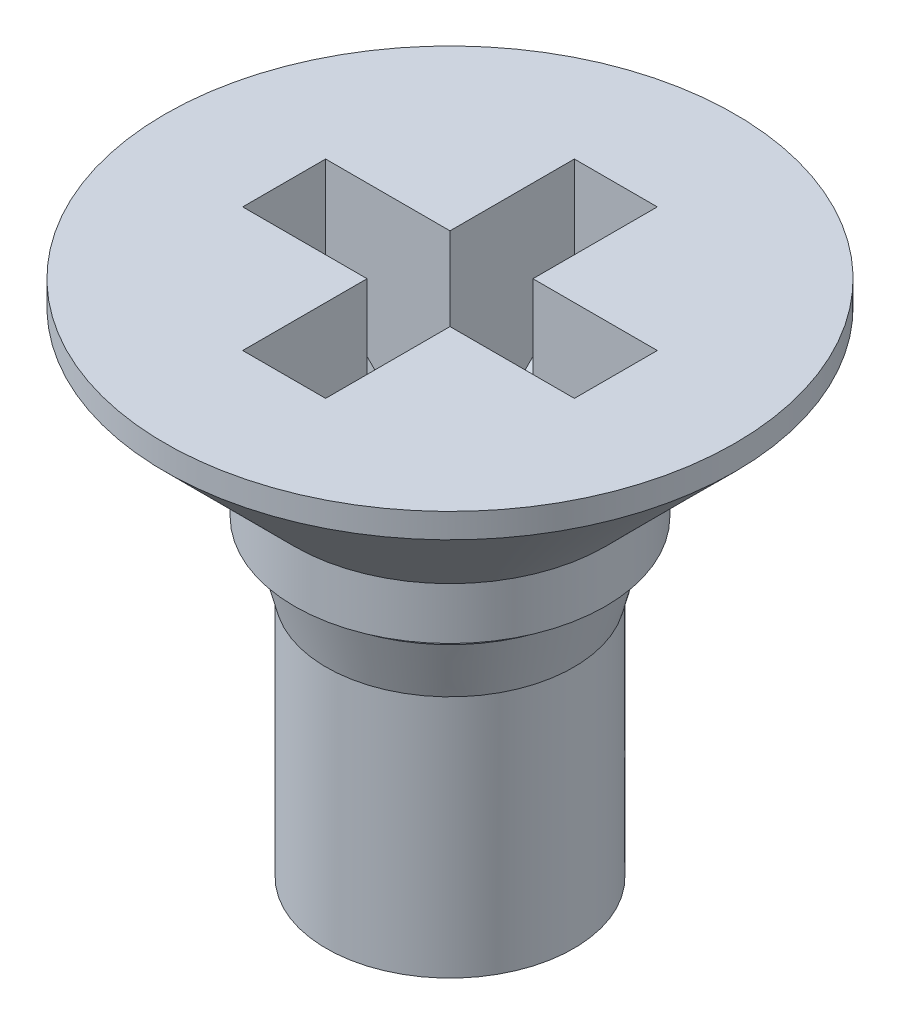
ISO-10303-21;
HEADER;
FILE_DESCRIPTION(('STEP AP214'),'2;1');
FILE_NAME('part.step','',(''),(''),'','','');
FILE_SCHEMA(('AUTOMOTIVE_DESIGN { 1 0 10303 214 1 1 1 1 }'));
ENDSEC;
DATA;
#1=APPLICATION_CONTEXT('core data for automotive mechanical design processes');
#2=APPLICATION_PROTOCOL_DEFINITION('international standard','automotive_design',2000,#1);
#3=PRODUCT_CONTEXT('',#1,'mechanical');
#4=PRODUCT('Part','Part','',(#3));
#5=PRODUCT_RELATED_PRODUCT_CATEGORY('part','',(#4));
#6=PRODUCT_DEFINITION_FORMATION('','',#4);
#7=PRODUCT_DEFINITION_CONTEXT('part definition',#1,'design');
#8=PRODUCT_DEFINITION('design','',#6,#7);
#9=PRODUCT_DEFINITION_SHAPE('','',#8);
#10=(LENGTH_UNIT() NAMED_UNIT(*) SI_UNIT(.MILLI.,.METRE.));
#11=(NAMED_UNIT(*) PLANE_ANGLE_UNIT() SI_UNIT($,.RADIAN.));
#12=(NAMED_UNIT(*) SI_UNIT($,.STERADIAN.) SOLID_ANGLE_UNIT());
#13=UNCERTAINTY_MEASURE_WITH_UNIT(LENGTH_MEASURE(1.E-05),#10,'distance_accuracy_value','');
#14=(GEOMETRIC_REPRESENTATION_CONTEXT(3) GLOBAL_UNCERTAINTY_ASSIGNED_CONTEXT((#13)) GLOBAL_UNIT_ASSIGNED_CONTEXT((#10,
#11,#12)) REPRESENTATION_CONTEXT('',''));
#15=CARTESIAN_POINT('',(0.,0.,0.));
#16=DIRECTION('',(0.,0.,1.));
#17=DIRECTION('',(1.,0.,0.));
#18=AXIS2_PLACEMENT_3D('',#15,#16,#17);
#19=CARTESIAN_POINT('',(0.,0.,0.));
#20=DIRECTION('',(0.,1.,0.));
#21=DIRECTION('',(-1.,0.,0.));
#22=AXIS2_PLACEMENT_3D('',#19,#20,#21);
#23=CYLINDRICAL_SURFACE('',#22,1.1935);
#24=CARTESIAN_POINT('',(0.,-2.65,0.));
#25=DIRECTION('',(0.,1.,0.));
#26=DIRECTION('',(-1.,0.,0.));
#27=AXIS2_PLACEMENT_3D('',#24,#25,#26);
#28=CIRCLE('',#27,1.1935);
#29=CARTESIAN_POINT('',(-1.1935,-2.65,0.));
#30=VERTEX_POINT('',#29);
#31=EDGE_CURVE('E257',#30,#30,#28,.T.);
#32=ORIENTED_EDGE('',*,*,#31,.F.);
#33=EDGE_LOOP('',(#32));
#34=FACE_BOUND('',#33,.T.);
#35=CARTESIAN_POINT('',(0.,-5.,0.));
#36=DIRECTION('',(0.,-1.,0.));
#37=DIRECTION('',(0.,0.,-1.));
#38=AXIS2_PLACEMENT_3D('',#35,#36,#37);
#39=CIRCLE('',#38,1.1935);
#40=CARTESIAN_POINT('',(0.,-5.,-1.1935));
#41=VERTEX_POINT('',#40);
#42=EDGE_CURVE('E11',#41,#41,#39,.T.);
#43=ORIENTED_EDGE('',*,*,#42,.F.);
#44=EDGE_LOOP('',(#43));
#45=FACE_BOUND('',#44,.T.);
#46=ADVANCED_FACE('F38',(#34,#45),#23,.T.);
#47=CARTESIAN_POINT('',(0.,-2.65,-0.4));
#48=DIRECTION('',(0.,0.,-1.));
#49=DIRECTION('',(-1.,0.,0.));
#50=AXIS2_PLACEMENT_3D('',#47,#48,#49);
#51=PLANE('',#50);
#52=DIRECTION('',(0.,1.,0.));
#53=VECTOR('',#52,1.);
#54=CARTESIAN_POINT('',(0.4,-2.65,-0.4));
#55=LINE('',#54,#53);
#56=CARTESIAN_POINT('',(0.4,-2.1,-0.4));
#57=VERTEX_POINT('',#56);
#58=CARTESIAN_POINT('',(0.4,0.,-0.4));
#59=VERTEX_POINT('',#58);
#60=EDGE_CURVE('E202',#57,#59,#55,.T.);
#61=ORIENTED_EDGE('',*,*,#60,.F.);
#62=DIRECTION('',(1.,0.,0.));
#63=VECTOR('',#62,1.);
#64=CARTESIAN_POINT('',(-0.550000000000002,-2.1,-0.4));
#65=LINE('',#64,#63);
#66=CARTESIAN_POINT('',(0.550000000000002,-2.1,-0.4));
#67=VERTEX_POINT('',#66);
#68=EDGE_CURVE('E237',#57,#67,#65,.T.);
#69=ORIENTED_EDGE('',*,*,#68,.T.);
#70=DIRECTION('',(0.707106781186546,0.707106781186548,0.));
#71=VECTOR('',#70,1.);
#72=CARTESIAN_POINT('',(1.6,-1.05,-0.4));
#73=LINE('',#72,#71);
#74=CARTESIAN_POINT('',(1.6,-1.05,-0.4));
#75=VERTEX_POINT('',#74);
#76=EDGE_CURVE('E241',#67,#75,#73,.T.);
#77=ORIENTED_EDGE('',*,*,#76,.T.);
#78=DIRECTION('',(0.,1.,0.));
#79=VECTOR('',#78,1.);
#80=CARTESIAN_POINT('',(1.6,0.,-0.4));
#81=LINE('',#80,#79);
#82=CARTESIAN_POINT('',(1.6,0.,-0.4));
#83=VERTEX_POINT('',#82);
#84=EDGE_CURVE('E244',#75,#83,#81,.T.);
#85=ORIENTED_EDGE('',*,*,#84,.T.);
#86=DIRECTION('',(-1.,0.,0.));
#87=VECTOR('',#86,1.);
#88=CARTESIAN_POINT('',(1.6,0.,-0.4));
#89=LINE('',#88,#87);
#90=EDGE_CURVE('E248',#83,#59,#89,.T.);
#91=ORIENTED_EDGE('',*,*,#90,.T.);
#92=EDGE_LOOP('',(#61,#69,#77,#85,#91));
#93=FACE_BOUND('',#92,.T.);
#94=ADVANCED_FACE('F328',(#93),#51,.F.);
#95=CARTESIAN_POINT('',(0.,-2.65,0.4));
#96=DIRECTION('',(0.,0.,-1.));
#97=DIRECTION('',(-1.,0.,0.));
#98=AXIS2_PLACEMENT_3D('',#95,#96,#97);
#99=PLANE('',#98);
#100=DIRECTION('',(1.,0.,0.));
#101=VECTOR('',#100,1.);
#102=CARTESIAN_POINT('',(-0.550000000000002,-2.1,0.4));
#103=LINE('',#102,#101);
#104=CARTESIAN_POINT('',(0.4,-2.1,0.4));
#105=VERTEX_POINT('',#104);
#106=CARTESIAN_POINT('',(0.550000000000002,-2.1,0.4));
#107=VERTEX_POINT('',#106);
#108=EDGE_CURVE('E219',#105,#107,#103,.T.);
#109=ORIENTED_EDGE('',*,*,#108,.F.);
#110=DIRECTION('',(0.,1.,0.));
#111=VECTOR('',#110,1.);
#112=CARTESIAN_POINT('',(0.4,-2.65,0.4));
#113=LINE('',#112,#111);
#114=CARTESIAN_POINT('',(0.4,0.,0.4));
#115=VERTEX_POINT('',#114);
#116=EDGE_CURVE('E169',#105,#115,#113,.T.);
#117=ORIENTED_EDGE('',*,*,#116,.T.);
#118=DIRECTION('',(-1.,0.,0.));
#119=VECTOR('',#118,1.);
#120=CARTESIAN_POINT('',(1.6,0.,0.4));
#121=LINE('',#120,#119);
#122=CARTESIAN_POINT('',(1.6,0.,0.4));
#123=VERTEX_POINT('',#122);
#124=EDGE_CURVE('E228',#123,#115,#121,.T.);
#125=ORIENTED_EDGE('',*,*,#124,.F.);
#126=DIRECTION('',(0.,1.,0.));
#127=VECTOR('',#126,1.);
#128=CARTESIAN_POINT('',(1.6,0.,0.4));
#129=LINE('',#128,#127);
#130=CARTESIAN_POINT('',(1.6,-1.05,0.4));
#131=VERTEX_POINT('',#130);
#132=EDGE_CURVE('E225',#131,#123,#129,.T.);
#133=ORIENTED_EDGE('',*,*,#132,.F.);
#134=DIRECTION('',(0.707106781186546,0.707106781186548,0.));
#135=VECTOR('',#134,1.);
#136=CARTESIAN_POINT('',(1.6,-1.05,0.4));
#137=LINE('',#136,#135);
#138=EDGE_CURVE('E222',#107,#131,#137,.T.);
#139=ORIENTED_EDGE('',*,*,#138,.F.);
#140=EDGE_LOOP('',(#109,#117,#125,#133,#139));
#141=FACE_BOUND('',#140,.T.);
#142=ADVANCED_FACE('F336',(#141),#99,.T.);
#143=CARTESIAN_POINT('',(0.,0.,0.));
#144=DIRECTION('',(0.,-1.,0.));
#145=DIRECTION('',(1.,0.,0.));
#146=AXIS2_PLACEMENT_3D('',#143,#144,#145);
#147=PLANE('',#146);
#148=DIRECTION('',(1.,0.,0.));
#149=VECTOR('',#148,1.);
#150=CARTESIAN_POINT('',(-0.4,0.,1.6));
#151=LINE('',#150,#149);
#152=CARTESIAN_POINT('',(-0.4,0.,1.6));
#153=VERTEX_POINT('',#152);
#154=CARTESIAN_POINT('',(0.4,0.,1.6));
#155=VERTEX_POINT('',#154);
#156=EDGE_CURVE('E203',#153,#155,#151,.T.);
#157=ORIENTED_EDGE('',*,*,#156,.F.);
#158=DIRECTION('',(0.,0.,1.));
#159=VECTOR('',#158,1.);
#160=CARTESIAN_POINT('',(-0.4,0.,-1.6));
#161=LINE('',#160,#159);
#162=CARTESIAN_POINT('',(-0.4,0.,0.399999999999999));
#163=VERTEX_POINT('',#162);
#164=EDGE_CURVE('E196',#163,#153,#161,.T.);
#165=ORIENTED_EDGE('',*,*,#164,.F.);
#166=CARTESIAN_POINT('',(-1.6,0.,0.4));
#167=VERTEX_POINT('',#166);
#168=EDGE_CURVE('E227',#163,#167,#121,.T.);
#169=ORIENTED_EDGE('',*,*,#168,.T.);
#170=DIRECTION('',(0.,0.,1.));
#171=VECTOR('',#170,1.);
#172=CARTESIAN_POINT('',(-1.6,0.,-0.4));
#173=LINE('',#172,#171);
#174=CARTESIAN_POINT('',(-1.6,0.,-0.4));
#175=VERTEX_POINT('',#174);
#176=EDGE_CURVE('E258',#175,#167,#173,.T.);
#177=ORIENTED_EDGE('',*,*,#176,.F.);
#178=CARTESIAN_POINT('',(-0.4,0.,-0.4));
#179=VERTEX_POINT('',#178);
#180=EDGE_CURVE('E247',#179,#175,#89,.T.);
#181=ORIENTED_EDGE('',*,*,#180,.F.);
#182=CARTESIAN_POINT('',(-0.4,0.,-1.6));
#183=VERTEX_POINT('',#182);
#184=EDGE_CURVE('E197',#183,#179,#161,.T.);
#185=ORIENTED_EDGE('',*,*,#184,.F.);
#186=DIRECTION('',(1.,0.,0.));
#187=VECTOR('',#186,1.);
#188=CARTESIAN_POINT('',(-0.4,0.,-1.6));
#189=LINE('',#188,#187);
#190=CARTESIAN_POINT('',(0.4,0.,-1.6));
#191=VERTEX_POINT('',#190);
#192=EDGE_CURVE('E205',#183,#191,#189,.T.);
#193=ORIENTED_EDGE('',*,*,#192,.T.);
#194=DIRECTION('',(0.,0.,1.));
#195=VECTOR('',#194,1.);
#196=CARTESIAN_POINT('',(0.4,0.,-1.6));
#197=LINE('',#196,#195);
#198=EDGE_CURVE('E181',#191,#59,#197,.T.);
#199=ORIENTED_EDGE('',*,*,#198,.T.);
#200=ORIENTED_EDGE('',*,*,#90,.F.);
#201=DIRECTION('',(0.,0.,1.));
#202=VECTOR('',#201,1.);
#203=CARTESIAN_POINT('',(1.6,0.,-0.4));
#204=LINE('',#203,#202);
#205=EDGE_CURVE('E261',#83,#123,#204,.T.);
#206=ORIENTED_EDGE('',*,*,#205,.T.);
#207=ORIENTED_EDGE('',*,*,#124,.T.);
#208=EDGE_CURVE('E61',#115,#155,#197,.T.);
#209=ORIENTED_EDGE('',*,*,#208,.T.);
#210=EDGE_LOOP('',(#157,#165,#169,#177,#181,#185,#193,#199,#200,#206,#207,#209));
#211=FACE_BOUND('',#210,.T.);
#212=CARTESIAN_POINT('',(0.,0.,0.));
#213=DIRECTION('',(0.,1.,0.));
#214=DIRECTION('',(-1.,0.,0.));
#215=AXIS2_PLACEMENT_3D('',#212,#213,#214);
#216=CIRCLE('',#215,2.75);
#217=CARTESIAN_POINT('',(-2.75,0.,0.));
#218=VERTEX_POINT('',#217);
#219=EDGE_CURVE('E287',#218,#218,#216,.T.);
#220=ORIENTED_EDGE('',*,*,#219,.T.);
#221=EDGE_LOOP('',(#220));
#222=FACE_BOUND('',#221,.T.);
#223=ADVANCED_FACE('F40',(#211,#222),#147,.F.);
#224=CARTESIAN_POINT('',(0.,0.,0.));
#225=DIRECTION('',(0.,1.,0.));
#226=DIRECTION('',(-1.,0.,0.));
#227=AXIS2_PLACEMENT_3D('',#224,#225,#226);
#228=CYLINDRICAL_SURFACE('',#227,2.75);
#229=ORIENTED_EDGE('',*,*,#219,.F.);
#230=EDGE_LOOP('',(#229));
#231=FACE_BOUND('',#230,.T.);
#232=CARTESIAN_POINT('',(0.,-0.237500000000007,0.));
#233=DIRECTION('',(0.,1.,0.));
#234=DIRECTION('',(-1.,0.,0.));
#235=AXIS2_PLACEMENT_3D('',#232,#233,#234);
#236=CIRCLE('',#235,2.75);
#237=CARTESIAN_POINT('',(-2.75,-0.237500000000007,0.));
#238=VERTEX_POINT('',#237);
#239=EDGE_CURVE('E284',#238,#238,#236,.T.);
#240=ORIENTED_EDGE('',*,*,#239,.T.);
#241=EDGE_LOOP('',(#240));
#242=FACE_BOUND('',#241,.T.);
#243=ADVANCED_FACE('F379',(#231,#242),#228,.T.);
#244=CARTESIAN_POINT('',(0.,-1.4875,0.));
#245=DIRECTION('',(0.,1.,0.));
#246=DIRECTION('',(-1.,0.,0.));
#247=AXIS2_PLACEMENT_3D('',#244,#245,#246);
#248=CONICAL_SURFACE('',#247,1.5,0.78539816339745);
#249=ORIENTED_EDGE('',*,*,#239,.F.);
#250=EDGE_LOOP('',(#249));
#251=FACE_BOUND('',#250,.T.);
#252=CARTESIAN_POINT('',(0.,-1.4875,0.));
#253=DIRECTION('',(0.,1.,0.));
#254=DIRECTION('',(-1.,0.,0.));
#255=AXIS2_PLACEMENT_3D('',#252,#253,#254);
#256=CIRCLE('',#255,1.5);
#257=CARTESIAN_POINT('',(-1.5,-1.4875,0.));
#258=VERTEX_POINT('',#257);
#259=EDGE_CURVE('E281',#258,#258,#256,.T.);
#260=ORIENTED_EDGE('',*,*,#259,.T.);
#261=EDGE_LOOP('',(#260));
#262=FACE_BOUND('',#261,.T.);
#263=ADVANCED_FACE('F376',(#251,#262),#248,.T.);
#264=CARTESIAN_POINT('',(0.,0.,0.));
#265=DIRECTION('',(0.,1.,0.));
#266=DIRECTION('',(-1.,0.,0.));
#267=AXIS2_PLACEMENT_3D('',#264,#265,#266);
#268=CYLINDRICAL_SURFACE('',#267,1.5);
#269=ORIENTED_EDGE('',*,*,#259,.F.);
#270=EDGE_LOOP('',(#269));
#271=FACE_BOUND('',#270,.T.);
#272=CARTESIAN_POINT('',(0.,-1.9875,0.));
#273=DIRECTION('',(0.,1.,0.));
#274=DIRECTION('',(-1.,0.,0.));
#275=AXIS2_PLACEMENT_3D('',#272,#273,#274);
#276=CIRCLE('',#275,1.5);
#277=CARTESIAN_POINT('',(-1.5,-1.9875,0.));
#278=VERTEX_POINT('',#277);
#279=EDGE_CURVE('E278',#278,#278,#276,.T.);
#280=ORIENTED_EDGE('',*,*,#279,.T.);
#281=EDGE_LOOP('',(#280));
#282=FACE_BOUND('',#281,.T.);
#283=ADVANCED_FACE('F372',(#271,#282),#268,.T.);
#284=CARTESIAN_POINT('',(1.5,-1.9875,0.));
#285=DIRECTION('',(0.,1.,0.));
#286=DIRECTION('',(-1.,0.,0.));
#287=AXIS2_PLACEMENT_3D('',#284,#285,#286);
#288=PLANE('',#287);
#289=ORIENTED_EDGE('',*,*,#279,.F.);
#290=EDGE_LOOP('',(#289));
#291=FACE_BOUND('',#290,.T.);
#292=CARTESIAN_POINT('',(0.,-1.9875,0.));
#293=DIRECTION('',(0.,1.,0.));
#294=DIRECTION('',(-1.,0.,0.));
#295=AXIS2_PLACEMENT_3D('',#292,#293,#294);
#296=CIRCLE('',#295,1.3375);
#297=CARTESIAN_POINT('',(-1.3375,-1.9875,0.));
#298=VERTEX_POINT('',#297);
#299=EDGE_CURVE('E275',#298,#298,#296,.T.);
#300=ORIENTED_EDGE('',*,*,#299,.T.);
#301=EDGE_LOOP('',(#300));
#302=FACE_BOUND('',#301,.T.);
#303=ADVANCED_FACE('F368',(#291,#302),#288,.F.);
#304=CARTESIAN_POINT('',(0.,0.,0.));
#305=DIRECTION('',(0.,1.,0.));
#306=DIRECTION('',(-1.,0.,0.));
#307=AXIS2_PLACEMENT_3D('',#304,#305,#306);
#308=CYLINDRICAL_SURFACE('',#307,1.3375);
#309=ORIENTED_EDGE('',*,*,#299,.F.);
#310=EDGE_LOOP('',(#309));
#311=FACE_BOUND('',#310,.T.);
#312=CARTESIAN_POINT('',(0.,-2.11258468371008,0.));
#313=DIRECTION('',(0.,1.,0.));
#314=DIRECTION('',(-1.,0.,0.));
#315=AXIS2_PLACEMENT_3D('',#312,#313,#314);
#316=CIRCLE('',#315,1.3375);
#317=CARTESIAN_POINT('',(-1.3375,-2.11258468371008,0.));
#318=VERTEX_POINT('',#317);
#319=EDGE_CURVE('E272',#318,#318,#316,.T.);
#320=ORIENTED_EDGE('',*,*,#319,.T.);
#321=EDGE_LOOP('',(#320));
#322=FACE_BOUND('',#321,.T.);
#323=ADVANCED_FACE('F364',(#311,#322),#308,.T.);
#324=CARTESIAN_POINT('',(0.,-2.65,0.));
#325=DIRECTION('',(0.,1.,0.));
#326=DIRECTION('',(-1.,0.,0.));
#327=AXIS2_PLACEMENT_3D('',#324,#325,#326);
#328=CONICAL_SURFACE('',#327,1.1935,0.26179938779915);
#329=ORIENTED_EDGE('',*,*,#319,.F.);
#330=EDGE_LOOP('',(#329));
#331=FACE_BOUND('',#330,.T.);
#332=ORIENTED_EDGE('',*,*,#31,.T.);
#333=EDGE_LOOP('',(#332));
#334=FACE_BOUND('',#333,.T.);
#335=ADVANCED_FACE('F361',(#331,#334),#328,.T.);
#336=CARTESIAN_POINT('',(-1.6,-1.05,-0.4));
#337=DIRECTION('',(-0.707106781186548,-0.707106781186546,0.));
#338=DIRECTION('',(0.707106781186547,-0.707106781186548,0.));
#339=AXIS2_PLACEMENT_3D('',#336,#337,#338);
#340=PLANE('',#339);
#341=DIRECTION('',(0.,0.,1.));
#342=VECTOR('',#341,1.);
#343=CARTESIAN_POINT('',(-0.550000000000002,-2.1,-0.4));
#344=LINE('',#343,#342);
#345=CARTESIAN_POINT('',(-0.550000000000002,-2.1,-0.4));
#346=VERTEX_POINT('',#345);
#347=CARTESIAN_POINT('',(-0.550000000000002,-2.1,0.4));
#348=VERTEX_POINT('',#347);
#349=EDGE_CURVE('E254',#346,#348,#344,.T.);
#350=ORIENTED_EDGE('',*,*,#349,.F.);
#351=DIRECTION('',(0.707106781186546,-0.707106781186548,0.));
#352=VECTOR('',#351,1.);
#353=CARTESIAN_POINT('',(-1.6,-1.05,-0.4));
#354=LINE('',#353,#352);
#355=CARTESIAN_POINT('',(-1.6,-1.05,-0.4));
#356=VERTEX_POINT('',#355);
#357=EDGE_CURVE('E234',#356,#346,#354,.T.);
#358=ORIENTED_EDGE('',*,*,#357,.F.);
#359=DIRECTION('',(0.,0.,1.));
#360=VECTOR('',#359,1.);
#361=CARTESIAN_POINT('',(-1.6,-1.05,-0.4));
#362=LINE('',#361,#360);
#363=CARTESIAN_POINT('',(-1.6,-1.05,0.4));
#364=VERTEX_POINT('',#363);
#365=EDGE_CURVE('E255',#356,#364,#362,.T.);
#366=ORIENTED_EDGE('',*,*,#365,.T.);
#367=DIRECTION('',(0.707106781186546,-0.707106781186548,0.));
#368=VECTOR('',#367,1.);
#369=CARTESIAN_POINT('',(-1.6,-1.05,0.4));
#370=LINE('',#369,#368);
#371=EDGE_CURVE('E216',#364,#348,#370,.T.);
#372=ORIENTED_EDGE('',*,*,#371,.T.);
#373=EDGE_LOOP('',(#350,#358,#366,#372));
#374=FACE_BOUND('',#373,.T.);
#375=ADVANCED_FACE('F360',(#374),#340,.F.);
#376=CARTESIAN_POINT('',(-1.6,0.,-0.4));
#377=DIRECTION('',(-1.,0.,0.));
#378=DIRECTION('',(0.,0.,1.));
#379=AXIS2_PLACEMENT_3D('',#376,#377,#378);
#380=PLANE('',#379);
#381=ORIENTED_EDGE('',*,*,#365,.F.);
#382=DIRECTION('',(0.,-1.,0.));
#383=VECTOR('',#382,1.);
#384=CARTESIAN_POINT('',(-1.6,0.,-0.4));
#385=LINE('',#384,#383);
#386=EDGE_CURVE('E251',#175,#356,#385,.T.);
#387=ORIENTED_EDGE('',*,*,#386,.F.);
#388=ORIENTED_EDGE('',*,*,#176,.T.);
#389=DIRECTION('',(0.,-1.,0.));
#390=VECTOR('',#389,1.);
#391=CARTESIAN_POINT('',(-1.6,0.,0.4));
#392=LINE('',#391,#390);
#393=EDGE_CURVE('E231',#167,#364,#392,.T.);
#394=ORIENTED_EDGE('',*,*,#393,.T.);
#395=EDGE_LOOP('',(#381,#387,#388,#394));
#396=FACE_BOUND('',#395,.T.);
#397=ADVANCED_FACE('F307',(#396),#380,.F.);
#398=CARTESIAN_POINT('',(1.6,0.,-0.4));
#399=DIRECTION('',(1.,0.,0.));
#400=DIRECTION('',(0.,0.,-1.));
#401=AXIS2_PLACEMENT_3D('',#398,#399,#400);
#402=PLANE('',#401);
#403=ORIENTED_EDGE('',*,*,#205,.F.);
#404=ORIENTED_EDGE('',*,*,#84,.F.);
#405=DIRECTION('',(0.,0.,1.));
#406=VECTOR('',#405,1.);
#407=CARTESIAN_POINT('',(1.6,-1.05,-0.4));
#408=LINE('',#407,#406);
#409=EDGE_CURVE('E264',#75,#131,#408,.T.);
#410=ORIENTED_EDGE('',*,*,#409,.T.);
#411=ORIENTED_EDGE('',*,*,#132,.T.);
#412=EDGE_LOOP('',(#403,#404,#410,#411));
#413=FACE_BOUND('',#412,.T.);
#414=ADVANCED_FACE('F332',(#413),#402,.F.);
#415=CARTESIAN_POINT('',(1.6,-1.05,-0.4));
#416=DIRECTION('',(0.707106781186548,-0.707106781186546,0.));
#417=DIRECTION('',(0.707106781186547,0.707106781186548,0.));
#418=AXIS2_PLACEMENT_3D('',#415,#416,#417);
#419=PLANE('',#418);
#420=ORIENTED_EDGE('',*,*,#409,.F.);
#421=ORIENTED_EDGE('',*,*,#76,.F.);
#422=DIRECTION('',(0.,0.,1.));
#423=VECTOR('',#422,1.);
#424=CARTESIAN_POINT('',(0.550000000000002,-2.1,-0.4));
#425=LINE('',#424,#423);
#426=EDGE_CURVE('E266',#67,#107,#425,.T.);
#427=ORIENTED_EDGE('',*,*,#426,.T.);
#428=ORIENTED_EDGE('',*,*,#138,.T.);
#429=EDGE_LOOP('',(#420,#421,#427,#428));
#430=FACE_BOUND('',#429,.T.);
#431=ADVANCED_FACE('F340',(#430),#419,.F.);
#432=CARTESIAN_POINT('',(-0.550000000000002,-2.1,-0.4));
#433=DIRECTION('',(0.,-1.,0.));
#434=DIRECTION('',(0.,0.,-1.));
#435=AXIS2_PLACEMENT_3D('',#432,#433,#434);
#436=PLANE('',#435);
#437=CARTESIAN_POINT('',(-0.4,-2.1,0.4));
#438=VERTEX_POINT('',#437);
#439=EDGE_CURVE('E220',#348,#438,#103,.T.);
#440=ORIENTED_EDGE('',*,*,#439,.T.);
#441=DIRECTION('',(0.,0.,-1.));
#442=VECTOR('',#441,1.);
#443=CARTESIAN_POINT('',(-0.4,-2.1,0.550000000000002));
#444=LINE('',#443,#442);
#445=CARTESIAN_POINT('',(-0.4,-2.1,0.550000000000002));
#446=VERTEX_POINT('',#445);
#447=EDGE_CURVE('E158',#446,#438,#444,.T.);
#448=ORIENTED_EDGE('',*,*,#447,.F.);
#449=DIRECTION('',(1.,0.,0.));
#450=VECTOR('',#449,1.);
#451=CARTESIAN_POINT('',(-0.4,-2.1,0.550000000000002));
#452=LINE('',#451,#450);
#453=CARTESIAN_POINT('',(0.4,-2.1,0.550000000000002));
#454=VERTEX_POINT('',#453);
#455=EDGE_CURVE('E152',#446,#454,#452,.T.);
#456=ORIENTED_EDGE('',*,*,#455,.T.);
#457=DIRECTION('',(0.,0.,-1.));
#458=VECTOR('',#457,1.);
#459=CARTESIAN_POINT('',(0.4,-2.1,0.550000000000002));
#460=LINE('',#459,#458);
#461=EDGE_CURVE('E156',#454,#105,#460,.T.);
#462=ORIENTED_EDGE('',*,*,#461,.T.);
#463=ORIENTED_EDGE('',*,*,#108,.T.);
#464=ORIENTED_EDGE('',*,*,#426,.F.);
#465=ORIENTED_EDGE('',*,*,#68,.F.);
#466=CARTESIAN_POINT('',(0.4,-2.1,-0.550000000000002));
#467=VERTEX_POINT('',#466);
#468=EDGE_CURVE('E53',#57,#467,#460,.T.);
#469=ORIENTED_EDGE('',*,*,#468,.T.);
#470=DIRECTION('',(1.,0.,0.));
#471=VECTOR('',#470,1.);
#472=CARTESIAN_POINT('',(-0.4,-2.1,-0.550000000000002));
#473=LINE('',#472,#471);
#474=CARTESIAN_POINT('',(-0.4,-2.1,-0.550000000000002));
#475=VERTEX_POINT('',#474);
#476=EDGE_CURVE('E163',#475,#467,#473,.T.);
#477=ORIENTED_EDGE('',*,*,#476,.F.);
#478=CARTESIAN_POINT('',(-0.4,-2.1,-0.4));
#479=VERTEX_POINT('',#478);
#480=EDGE_CURVE('E188',#479,#475,#444,.T.);
#481=ORIENTED_EDGE('',*,*,#480,.F.);
#482=EDGE_CURVE('E238',#346,#479,#65,.T.);
#483=ORIENTED_EDGE('',*,*,#482,.F.);
#484=ORIENTED_EDGE('',*,*,#349,.T.);
#485=EDGE_LOOP('',(#440,#448,#456,#462,#463,#464,#465,#469,#477,#481,#483,#484));
#486=FACE_BOUND('',#485,.T.);
#487=ADVANCED_FACE('F155',(#486),#436,.F.);
#488=ORIENTED_EDGE('',*,*,#482,.T.);
#489=DIRECTION('',(0.,1.,0.));
#490=VECTOR('',#489,1.);
#491=CARTESIAN_POINT('',(-0.4,-2.65,-0.4));
#492=LINE('',#491,#490);
#493=EDGE_CURVE('E213',#479,#179,#492,.T.);
#494=ORIENTED_EDGE('',*,*,#493,.T.);
#495=ORIENTED_EDGE('',*,*,#180,.T.);
#496=ORIENTED_EDGE('',*,*,#386,.T.);
#497=ORIENTED_EDGE('',*,*,#357,.T.);
#498=EDGE_LOOP('',(#488,#494,#495,#496,#497));
#499=FACE_BOUND('',#498,.T.);
#500=ADVANCED_FACE('F311',(#499),#51,.F.);
#501=DIRECTION('',(0.,1.,0.));
#502=VECTOR('',#501,1.);
#503=CARTESIAN_POINT('',(-0.4,-2.65,0.4));
#504=LINE('',#503,#502);
#505=EDGE_CURVE('E46',#438,#163,#504,.T.);
#506=ORIENTED_EDGE('',*,*,#505,.F.);
#507=ORIENTED_EDGE('',*,*,#439,.F.);
#508=ORIENTED_EDGE('',*,*,#371,.F.);
#509=ORIENTED_EDGE('',*,*,#393,.F.);
#510=ORIENTED_EDGE('',*,*,#168,.F.);
#511=EDGE_LOOP('',(#506,#507,#508,#509,#510));
#512=FACE_BOUND('',#511,.T.);
#513=ADVANCED_FACE('F303',(#512),#99,.T.);
#514=CARTESIAN_POINT('',(-0.4,-1.05,1.6));
#515=DIRECTION('',(0.,-0.707106781186546,0.707106781186548));
#516=DIRECTION('',(0.,-0.707106781186548,-0.707106781186547));
#517=AXIS2_PLACEMENT_3D('',#514,#515,#516);
#518=PLANE('',#517);
#519=ORIENTED_EDGE('',*,*,#455,.F.);
#520=DIRECTION('',(0.,-0.707106781186548,-0.707106781186546));
#521=VECTOR('',#520,1.);
#522=CARTESIAN_POINT('',(-0.4,-1.05,1.6));
#523=LINE('',#522,#521);
#524=CARTESIAN_POINT('',(-0.4,-1.05,1.6));
#525=VERTEX_POINT('',#524);
#526=EDGE_CURVE('E186',#525,#446,#523,.T.);
#527=ORIENTED_EDGE('',*,*,#526,.F.);
#528=DIRECTION('',(1.,0.,0.));
#529=VECTOR('',#528,1.);
#530=CARTESIAN_POINT('',(-0.4,-1.05,1.6));
#531=LINE('',#530,#529);
#532=CARTESIAN_POINT('',(0.4,-1.05,1.6));
#533=VERTEX_POINT('',#532);
#534=EDGE_CURVE('E173',#525,#533,#531,.T.);
#535=ORIENTED_EDGE('',*,*,#534,.T.);
#536=DIRECTION('',(0.,-0.707106781186548,-0.707106781186546));
#537=VECTOR('',#536,1.);
#538=CARTESIAN_POINT('',(0.4,-1.05,1.6));
#539=LINE('',#538,#537);
#540=EDGE_CURVE('E168',#533,#454,#539,.T.);
#541=ORIENTED_EDGE('',*,*,#540,.T.);
#542=EDGE_LOOP('',(#519,#527,#535,#541));
#543=FACE_BOUND('',#542,.T.);
#544=ADVANCED_FACE('F172',(#543),#518,.F.);
#545=CARTESIAN_POINT('',(-0.4,-2.65,0.));
#546=DIRECTION('',(-1.,0.,0.));
#547=DIRECTION('',(0.,0.,1.));
#548=AXIS2_PLACEMENT_3D('',#545,#546,#547);
#549=PLANE('',#548);
#550=ORIENTED_EDGE('',*,*,#505,.T.);
#551=ORIENTED_EDGE('',*,*,#164,.T.);
#552=DIRECTION('',(0.,-1.,0.));
#553=VECTOR('',#552,1.);
#554=CARTESIAN_POINT('',(-0.4,0.,1.6));
#555=LINE('',#554,#553);
#556=EDGE_CURVE('E164',#153,#525,#555,.T.);
#557=ORIENTED_EDGE('',*,*,#556,.T.);
#558=ORIENTED_EDGE('',*,*,#526,.T.);
#559=ORIENTED_EDGE('',*,*,#447,.T.);
#560=EDGE_LOOP('',(#550,#551,#557,#558,#559));
#561=FACE_BOUND('',#560,.T.);
#562=ADVANCED_FACE('F293',(#561),#549,.F.);
#563=CARTESIAN_POINT('',(0.4,-2.65,0.));
#564=DIRECTION('',(-1.,0.,0.));
#565=DIRECTION('',(0.,0.,1.));
#566=AXIS2_PLACEMENT_3D('',#563,#564,#565);
#567=PLANE('',#566);
#568=ORIENTED_EDGE('',*,*,#461,.F.);
#569=ORIENTED_EDGE('',*,*,#540,.F.);
#570=DIRECTION('',(0.,-1.,0.));
#571=VECTOR('',#570,1.);
#572=CARTESIAN_POINT('',(0.4,0.,1.6));
#573=LINE('',#572,#571);
#574=EDGE_CURVE('E184',#155,#533,#573,.T.);
#575=ORIENTED_EDGE('',*,*,#574,.F.);
#576=ORIENTED_EDGE('',*,*,#208,.F.);
#577=ORIENTED_EDGE('',*,*,#116,.F.);
#578=EDGE_LOOP('',(#568,#569,#575,#576,#577));
#579=FACE_BOUND('',#578,.T.);
#580=ADVANCED_FACE('F167',(#579),#567,.T.);
#581=CARTESIAN_POINT('',(-0.4,0.,1.6));
#582=DIRECTION('',(0.,0.,1.));
#583=DIRECTION('',(1.,0.,0.));
#584=AXIS2_PLACEMENT_3D('',#581,#582,#583);
#585=PLANE('',#584);
#586=ORIENTED_EDGE('',*,*,#534,.F.);
#587=ORIENTED_EDGE('',*,*,#556,.F.);
#588=ORIENTED_EDGE('',*,*,#156,.T.);
#589=ORIENTED_EDGE('',*,*,#574,.T.);
#590=EDGE_LOOP('',(#586,#587,#588,#589));
#591=FACE_BOUND('',#590,.T.);
#592=ADVANCED_FACE('F491',(#591),#585,.F.);
#593=ORIENTED_EDGE('',*,*,#480,.T.);
#594=DIRECTION('',(0.,0.707106781186548,-0.707106781186546));
#595=VECTOR('',#594,1.);
#596=CARTESIAN_POINT('',(-0.4,-1.05,-1.6));
#597=LINE('',#596,#595);
#598=CARTESIAN_POINT('',(-0.4,-1.05,-1.6));
#599=VERTEX_POINT('',#598);
#600=EDGE_CURVE('E190',#475,#599,#597,.T.);
#601=ORIENTED_EDGE('',*,*,#600,.T.);
#602=DIRECTION('',(0.,1.,0.));
#603=VECTOR('',#602,1.);
#604=CARTESIAN_POINT('',(-0.4,0.,-1.6));
#605=LINE('',#604,#603);
#606=EDGE_CURVE('E193',#599,#183,#605,.T.);
#607=ORIENTED_EDGE('',*,*,#606,.T.);
#608=ORIENTED_EDGE('',*,*,#184,.T.);
#609=ORIENTED_EDGE('',*,*,#493,.F.);
#610=EDGE_LOOP('',(#593,#601,#607,#608,#609));
#611=FACE_BOUND('',#610,.T.);
#612=ADVANCED_FACE('F315',(#611),#549,.F.);
#613=ORIENTED_EDGE('',*,*,#60,.T.);
#614=ORIENTED_EDGE('',*,*,#198,.F.);
#615=DIRECTION('',(0.,1.,0.));
#616=VECTOR('',#615,1.);
#617=CARTESIAN_POINT('',(0.4,0.,-1.6));
#618=LINE('',#617,#616);
#619=CARTESIAN_POINT('',(0.4,-1.05,-1.6));
#620=VERTEX_POINT('',#619);
#621=EDGE_CURVE('E179',#620,#191,#618,.T.);
#622=ORIENTED_EDGE('',*,*,#621,.F.);
#623=DIRECTION('',(0.,0.707106781186548,-0.707106781186546));
#624=VECTOR('',#623,1.);
#625=CARTESIAN_POINT('',(0.4,-1.05,-1.6));
#626=LINE('',#625,#624);
#627=EDGE_CURVE('E170',#467,#620,#626,.T.);
#628=ORIENTED_EDGE('',*,*,#627,.F.);
#629=ORIENTED_EDGE('',*,*,#468,.F.);
#630=EDGE_LOOP('',(#613,#614,#622,#628,#629));
#631=FACE_BOUND('',#630,.T.);
#632=ADVANCED_FACE('F493',(#631),#567,.T.);
#633=CARTESIAN_POINT('',(-0.4,0.,-1.6));
#634=DIRECTION('',(0.,0.,-1.));
#635=DIRECTION('',(-1.,0.,0.));
#636=AXIS2_PLACEMENT_3D('',#633,#634,#635);
#637=PLANE('',#636);
#638=ORIENTED_EDGE('',*,*,#192,.F.);
#639=ORIENTED_EDGE('',*,*,#606,.F.);
#640=DIRECTION('',(1.,0.,0.));
#641=VECTOR('',#640,1.);
#642=CARTESIAN_POINT('',(-0.4,-1.05,-1.6));
#643=LINE('',#642,#641);
#644=EDGE_CURVE('E208',#599,#620,#643,.T.);
#645=ORIENTED_EDGE('',*,*,#644,.T.);
#646=ORIENTED_EDGE('',*,*,#621,.T.);
#647=EDGE_LOOP('',(#638,#639,#645,#646));
#648=FACE_BOUND('',#647,.T.);
#649=ADVANCED_FACE('F323',(#648),#637,.F.);
#650=CARTESIAN_POINT('',(-0.4,-1.05,-1.6));
#651=DIRECTION('',(0.,-0.707106781186546,-0.707106781186548));
#652=DIRECTION('',(0.,0.707106781186548,-0.707106781186547));
#653=AXIS2_PLACEMENT_3D('',#650,#651,#652);
#654=PLANE('',#653);
#655=ORIENTED_EDGE('',*,*,#644,.F.);
#656=ORIENTED_EDGE('',*,*,#600,.F.);
#657=ORIENTED_EDGE('',*,*,#476,.T.);
#658=ORIENTED_EDGE('',*,*,#627,.T.);
#659=EDGE_LOOP('',(#655,#656,#657,#658));
#660=FACE_BOUND('',#659,.T.);
#661=ADVANCED_FACE('F320',(#660),#654,.F.);
#662=CARTESIAN_POINT('',(2.,-5.,1.1935));
#663=DIRECTION('',(0.,-1.,0.));
#664=DIRECTION('',(0.,0.,-1.));
#665=AXIS2_PLACEMENT_3D('',#662,#663,#664);
#666=PLANE('',#665);
#667=ORIENTED_EDGE('',*,*,#42,.T.);
#668=EDGE_LOOP('',(#667));
#669=FACE_BOUND('',#668,.T.);
#670=ADVANCED_FACE('F531',(#669),#666,.T.);
#671=CLOSED_SHELL('',(#46,#94,#142,#223,#243,#263,#283,#303,#323,#335,#375,#397,#414,#431,#487,
#500,#513,#544,#562,#580,#592,#612,#632,#649,#661,#670));
#672=MANIFOLD_SOLID_BREP('B2',#671);
#673=ADVANCED_BREP_SHAPE_REPRESENTATION('',(#18,#672),#14);
#674=SHAPE_DEFINITION_REPRESENTATION(#9,#673);
ENDSEC;
END-ISO-10303-21;
